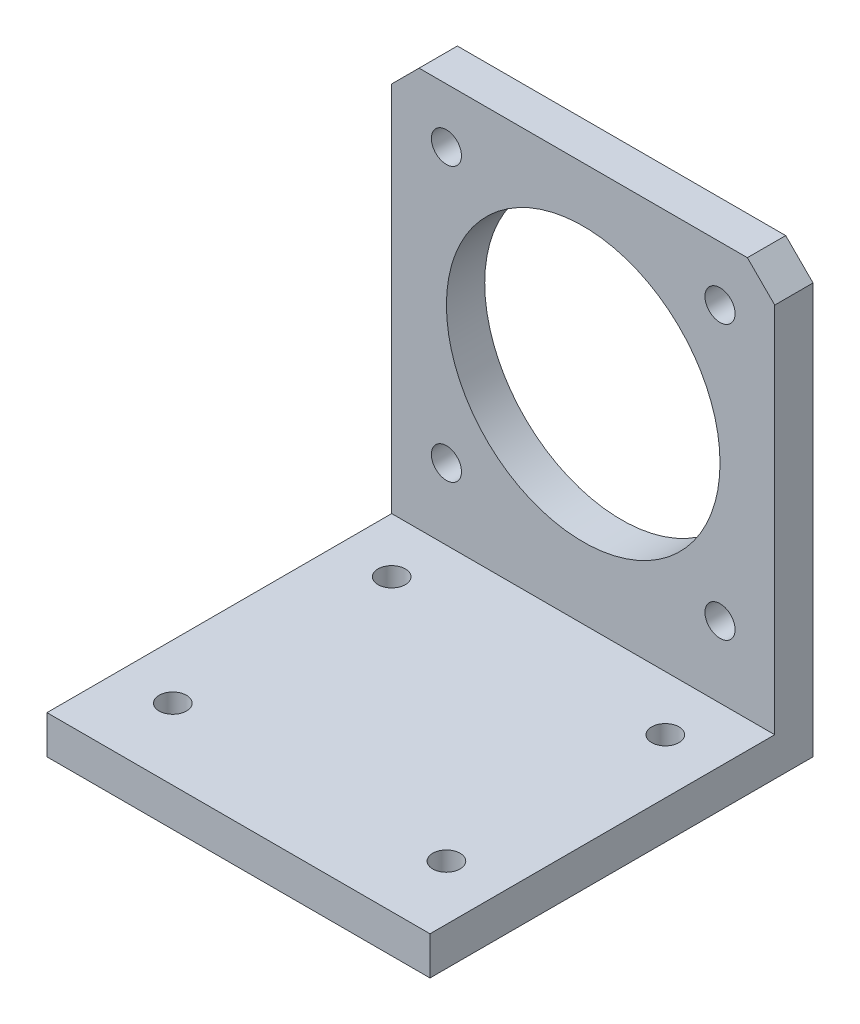
ISO-10303-21;
HEADER;
FILE_DESCRIPTION(('STEP AP214'),'2;1');
FILE_NAME('part.step','',(''),(''),'','','');
FILE_SCHEMA(('AUTOMOTIVE_DESIGN { 1 0 10303 214 1 1 1 1 }'));
ENDSEC;
DATA;
#1=APPLICATION_CONTEXT('core data for automotive mechanical design processes');
#2=APPLICATION_PROTOCOL_DEFINITION('international standard','automotive_design',2000,#1);
#3=PRODUCT_CONTEXT('',#1,'mechanical');
#4=PRODUCT('Part','Part','',(#3));
#5=PRODUCT_RELATED_PRODUCT_CATEGORY('part','',(#4));
#6=PRODUCT_DEFINITION_FORMATION('','',#4);
#7=PRODUCT_DEFINITION_CONTEXT('part definition',#1,'design');
#8=PRODUCT_DEFINITION('design','',#6,#7);
#9=PRODUCT_DEFINITION_SHAPE('','',#8);
#10=(LENGTH_UNIT() NAMED_UNIT(*) SI_UNIT(.MILLI.,.METRE.));
#11=(NAMED_UNIT(*) PLANE_ANGLE_UNIT() SI_UNIT($,.RADIAN.));
#12=(NAMED_UNIT(*) SI_UNIT($,.STERADIAN.) SOLID_ANGLE_UNIT());
#13=UNCERTAINTY_MEASURE_WITH_UNIT(LENGTH_MEASURE(1.E-05),#10,'distance_accuracy_value','');
#14=(GEOMETRIC_REPRESENTATION_CONTEXT(3) GLOBAL_UNCERTAINTY_ASSIGNED_CONTEXT((#13)) GLOBAL_UNIT_ASSIGNED_CONTEXT((#10,
#11,#12)) REPRESENTATION_CONTEXT('',''));
#15=CARTESIAN_POINT('',(0.,0.,0.));
#16=DIRECTION('',(0.,0.,1.));
#17=DIRECTION('',(1.,0.,0.));
#18=AXIS2_PLACEMENT_3D('',#15,#16,#17);
#19=CARTESIAN_POINT('',(0.,0.,7.));
#20=DIRECTION('',(0.,0.,1.));
#21=DIRECTION('',(1.,0.,0.));
#22=AXIS2_PLACEMENT_3D('',#19,#20,#21);
#23=PLANE('',#22);
#24=DIRECTION('',(-1.,0.,0.));
#25=VECTOR('',#24,1.);
#26=CARTESIAN_POINT('',(-35.,40.,7.));
#27=LINE('',#26,#25);
#28=CARTESIAN_POINT('',(30.,40.,7.));
#29=VERTEX_POINT('',#28);
#30=CARTESIAN_POINT('',(-30.,40.,7.));
#31=VERTEX_POINT('',#30);
#32=EDGE_CURVE('E165',#29,#31,#27,.T.);
#33=ORIENTED_EDGE('',*,*,#32,.T.);
#34=DIRECTION('',(0.707106781186549,0.707106781186547,0.));
#35=VECTOR('',#34,1.);
#36=CARTESIAN_POINT('',(-35.,35.0000000000001,7.));
#37=LINE('',#36,#35);
#38=CARTESIAN_POINT('',(-35.,35.,7.));
#39=VERTEX_POINT('',#38);
#40=EDGE_CURVE('E43',#31,#39,#37,.F.);
#41=ORIENTED_EDGE('',*,*,#40,.T.);
#42=DIRECTION('',(0.,-1.,0.));
#43=VECTOR('',#42,1.);
#44=CARTESIAN_POINT('',(-35.,40.,7.));
#45=LINE('',#44,#43);
#46=CARTESIAN_POINT('',(-35.,-33.,7.));
#47=VERTEX_POINT('',#46);
#48=EDGE_CURVE('E168',#39,#47,#45,.T.);
#49=ORIENTED_EDGE('',*,*,#48,.T.);
#50=DIRECTION('',(-1.,0.,0.));
#51=VECTOR('',#50,1.);
#52=CARTESIAN_POINT('',(0.,-33.,7.));
#53=LINE('',#52,#51);
#54=CARTESIAN_POINT('',(35.,-33.,7.));
#55=VERTEX_POINT('',#54);
#56=EDGE_CURVE('E130',#55,#47,#53,.T.);
#57=ORIENTED_EDGE('',*,*,#56,.F.);
#58=DIRECTION('',(0.,1.,0.));
#59=VECTOR('',#58,1.);
#60=CARTESIAN_POINT('',(35.,40.,7.));
#61=LINE('',#60,#59);
#62=CARTESIAN_POINT('',(35.,35.,7.));
#63=VERTEX_POINT('',#62);
#64=EDGE_CURVE('E107',#55,#63,#61,.T.);
#65=ORIENTED_EDGE('',*,*,#64,.T.);
#66=DIRECTION('',(0.707106781186547,-0.707106781186549,0.));
#67=VECTOR('',#66,1.);
#68=CARTESIAN_POINT('',(35.,35.,7.));
#69=LINE('',#68,#67);
#70=EDGE_CURVE('E192',#63,#29,#69,.F.);
#71=ORIENTED_EDGE('',*,*,#70,.T.);
#72=EDGE_LOOP('',(#33,#41,#49,#57,#65,#71));
#73=FACE_BOUND('',#72,.T.);
#74=CARTESIAN_POINT('',(25.0000000000005,-20.,7.));
#75=DIRECTION('',(0.,0.,1.));
#76=DIRECTION('',(1.,0.,0.));
#77=AXIS2_PLACEMENT_3D('',#74,#75,#76);
#78=CIRCLE('',#77,2.75);
#79=CARTESIAN_POINT('',(27.7500000000005,-20.,7.));
#80=VERTEX_POINT('',#79);
#81=EDGE_CURVE('E140',#80,#80,#78,.T.);
#82=ORIENTED_EDGE('',*,*,#81,.F.);
#83=EDGE_LOOP('',(#82));
#84=FACE_BOUND('',#83,.T.);
#85=CARTESIAN_POINT('',(25.,30.,7.));
#86=DIRECTION('',(0.,0.,1.));
#87=DIRECTION('',(1.,0.,0.));
#88=AXIS2_PLACEMENT_3D('',#85,#86,#87);
#89=CIRCLE('',#88,2.75);
#90=CARTESIAN_POINT('',(27.75,30.,7.));
#91=VERTEX_POINT('',#90);
#92=EDGE_CURVE('E152',#91,#91,#89,.T.);
#93=ORIENTED_EDGE('',*,*,#92,.F.);
#94=EDGE_LOOP('',(#93));
#95=FACE_BOUND('',#94,.T.);
#96=CARTESIAN_POINT('',(-25.,30.,7.));
#97=DIRECTION('',(0.,0.,1.));
#98=DIRECTION('',(1.,0.,0.));
#99=AXIS2_PLACEMENT_3D('',#96,#97,#98);
#100=CIRCLE('',#99,2.75);
#101=CARTESIAN_POINT('',(-22.25,30.,7.));
#102=VERTEX_POINT('',#101);
#103=EDGE_CURVE('E158',#102,#102,#100,.T.);
#104=ORIENTED_EDGE('',*,*,#103,.F.);
#105=EDGE_LOOP('',(#104));
#106=FACE_BOUND('',#105,.T.);
#107=CARTESIAN_POINT('',(-24.9999999999995,-20.,7.));
#108=DIRECTION('',(0.,0.,1.));
#109=DIRECTION('',(1.,0.,0.));
#110=AXIS2_PLACEMENT_3D('',#107,#108,#109);
#111=CIRCLE('',#110,2.75);
#112=CARTESIAN_POINT('',(-22.2499999999995,-20.,7.));
#113=VERTEX_POINT('',#112);
#114=EDGE_CURVE('E146',#113,#113,#111,.T.);
#115=ORIENTED_EDGE('',*,*,#114,.F.);
#116=EDGE_LOOP('',(#115));
#117=FACE_BOUND('',#116,.T.);
#118=CARTESIAN_POINT('',(0.,5.,7.));
#119=DIRECTION('',(0.,0.,1.));
#120=DIRECTION('',(1.,0.,0.));
#121=AXIS2_PLACEMENT_3D('',#118,#119,#120);
#122=CIRCLE('',#121,25.);
#123=CARTESIAN_POINT('',(25.,5.,7.));
#124=VERTEX_POINT('',#123);
#125=EDGE_CURVE('E134',#124,#124,#122,.T.);
#126=ORIENTED_EDGE('',*,*,#125,.F.);
#127=EDGE_LOOP('',(#126));
#128=FACE_BOUND('',#127,.T.);
#129=ADVANCED_FACE('F35',(#73,#84,#95,#106,#117,#128),#23,.T.);
#130=CARTESIAN_POINT('',(0.,0.,0.));
#131=DIRECTION('',(0.,0.,1.));
#132=DIRECTION('',(1.,0.,0.));
#133=AXIS2_PLACEMENT_3D('',#130,#131,#132);
#134=PLANE('',#133);
#135=CARTESIAN_POINT('',(25.0000000000005,-20.,0.));
#136=DIRECTION('',(0.,0.,1.));
#137=DIRECTION('',(1.,0.,0.));
#138=AXIS2_PLACEMENT_3D('',#135,#136,#137);
#139=CIRCLE('',#138,2.75);
#140=CARTESIAN_POINT('',(27.7500000000005,-20.,0.));
#141=VERTEX_POINT('',#140);
#142=EDGE_CURVE('E137',#141,#141,#139,.T.);
#143=ORIENTED_EDGE('',*,*,#142,.T.);
#144=EDGE_LOOP('',(#143));
#145=FACE_BOUND('',#144,.T.);
#146=CARTESIAN_POINT('',(25.,30.,0.));
#147=DIRECTION('',(0.,0.,1.));
#148=DIRECTION('',(1.,0.,0.));
#149=AXIS2_PLACEMENT_3D('',#146,#147,#148);
#150=CIRCLE('',#149,2.75);
#151=CARTESIAN_POINT('',(27.75,30.,0.));
#152=VERTEX_POINT('',#151);
#153=EDGE_CURVE('E149',#152,#152,#150,.T.);
#154=ORIENTED_EDGE('',*,*,#153,.T.);
#155=EDGE_LOOP('',(#154));
#156=FACE_BOUND('',#155,.T.);
#157=DIRECTION('',(0.,-1.,0.));
#158=VECTOR('',#157,1.);
#159=CARTESIAN_POINT('',(-35.,40.,0.));
#160=LINE('',#159,#158);
#161=CARTESIAN_POINT('',(-35.,35.,0.));
#162=VERTEX_POINT('',#161);
#163=CARTESIAN_POINT('',(-35.,-40.,0.));
#164=VERTEX_POINT('',#163);
#165=EDGE_CURVE('E174',#162,#164,#160,.T.);
#166=ORIENTED_EDGE('',*,*,#165,.F.);
#167=DIRECTION('',(-0.707106781186549,-0.707106781186547,0.));
#168=VECTOR('',#167,1.);
#169=CARTESIAN_POINT('',(-35.,35.,0.));
#170=LINE('',#169,#168);
#171=CARTESIAN_POINT('',(-30.,40.,0.));
#172=VERTEX_POINT('',#171);
#173=EDGE_CURVE('E186',#162,#172,#170,.F.);
#174=ORIENTED_EDGE('',*,*,#173,.T.);
#175=DIRECTION('',(-1.,0.,0.));
#176=VECTOR('',#175,1.);
#177=CARTESIAN_POINT('',(-35.,40.,0.));
#178=LINE('',#177,#176);
#179=CARTESIAN_POINT('',(30.,40.,0.));
#180=VERTEX_POINT('',#179);
#181=EDGE_CURVE('E172',#180,#172,#178,.T.);
#182=ORIENTED_EDGE('',*,*,#181,.F.);
#183=DIRECTION('',(-0.707106781186547,0.707106781186549,0.));
#184=VECTOR('',#183,1.);
#185=CARTESIAN_POINT('',(30.,40.,0.));
#186=LINE('',#185,#184);
#187=CARTESIAN_POINT('',(35.,35.,0.));
#188=VERTEX_POINT('',#187);
#189=EDGE_CURVE('E184',#180,#188,#186,.F.);
#190=ORIENTED_EDGE('',*,*,#189,.T.);
#191=DIRECTION('',(0.,1.,0.));
#192=VECTOR('',#191,1.);
#193=CARTESIAN_POINT('',(35.,40.,0.));
#194=LINE('',#193,#192);
#195=CARTESIAN_POINT('',(35.,-40.,0.));
#196=VERTEX_POINT('',#195);
#197=EDGE_CURVE('E161',#196,#188,#194,.T.);
#198=ORIENTED_EDGE('',*,*,#197,.F.);
#199=DIRECTION('',(1.,0.,0.));
#200=VECTOR('',#199,1.);
#201=CARTESIAN_POINT('',(-35.,-40.,0.));
#202=LINE('',#201,#200);
#203=EDGE_CURVE('E166',#164,#196,#202,.T.);
#204=ORIENTED_EDGE('',*,*,#203,.F.);
#205=EDGE_LOOP('',(#166,#174,#182,#190,#198,#204));
#206=FACE_BOUND('',#205,.T.);
#207=CARTESIAN_POINT('',(-25.,30.,0.));
#208=DIRECTION('',(0.,0.,1.));
#209=DIRECTION('',(1.,0.,0.));
#210=AXIS2_PLACEMENT_3D('',#207,#208,#209);
#211=CIRCLE('',#210,2.75);
#212=CARTESIAN_POINT('',(-22.25,30.,0.));
#213=VERTEX_POINT('',#212);
#214=EDGE_CURVE('E155',#213,#213,#211,.T.);
#215=ORIENTED_EDGE('',*,*,#214,.T.);
#216=EDGE_LOOP('',(#215));
#217=FACE_BOUND('',#216,.T.);
#218=CARTESIAN_POINT('',(-24.9999999999995,-20.,0.));
#219=DIRECTION('',(0.,0.,1.));
#220=DIRECTION('',(1.,0.,0.));
#221=AXIS2_PLACEMENT_3D('',#218,#219,#220);
#222=CIRCLE('',#221,2.75);
#223=CARTESIAN_POINT('',(-22.2499999999995,-20.,0.));
#224=VERTEX_POINT('',#223);
#225=EDGE_CURVE('E143',#224,#224,#222,.T.);
#226=ORIENTED_EDGE('',*,*,#225,.T.);
#227=EDGE_LOOP('',(#226));
#228=FACE_BOUND('',#227,.T.);
#229=CARTESIAN_POINT('',(0.,5.,0.));
#230=DIRECTION('',(0.,0.,1.));
#231=DIRECTION('',(1.,0.,0.));
#232=AXIS2_PLACEMENT_3D('',#229,#230,#231);
#233=CIRCLE('',#232,25.);
#234=CARTESIAN_POINT('',(25.,5.,0.));
#235=VERTEX_POINT('',#234);
#236=EDGE_CURVE('E133',#235,#235,#233,.T.);
#237=ORIENTED_EDGE('',*,*,#236,.T.);
#238=EDGE_LOOP('',(#237));
#239=FACE_BOUND('',#238,.T.);
#240=ADVANCED_FACE('F205',(#145,#156,#206,#217,#228,#239),#134,.F.);
#241=CARTESIAN_POINT('',(35.,40.,7.));
#242=DIRECTION('',(-1.,0.,0.));
#243=DIRECTION('',(0.,0.,1.));
#244=AXIS2_PLACEMENT_3D('',#241,#242,#243);
#245=PLANE('',#244);
#246=ORIENTED_EDGE('',*,*,#197,.T.);
#247=DIRECTION('',(0.,0.,1.));
#248=VECTOR('',#247,1.);
#249=CARTESIAN_POINT('',(35.,35.,7.));
#250=LINE('',#249,#248);
#251=EDGE_CURVE('E11',#188,#63,#250,.T.);
#252=ORIENTED_EDGE('',*,*,#251,.T.);
#253=ORIENTED_EDGE('',*,*,#64,.F.);
#254=DIRECTION('',(0.,0.,1.));
#255=VECTOR('',#254,1.);
#256=CARTESIAN_POINT('',(35.,-33.,0.));
#257=LINE('',#256,#255);
#258=CARTESIAN_POINT('',(35.,-33.,70.));
#259=VERTEX_POINT('',#258);
#260=EDGE_CURVE('E101',#55,#259,#257,.T.);
#261=ORIENTED_EDGE('',*,*,#260,.T.);
#262=DIRECTION('',(0.,-1.,0.));
#263=VECTOR('',#262,1.);
#264=CARTESIAN_POINT('',(35.,-33.,70.));
#265=LINE('',#264,#263);
#266=CARTESIAN_POINT('',(35.,-40.,70.));
#267=VERTEX_POINT('',#266);
#268=EDGE_CURVE('E105',#259,#267,#265,.T.);
#269=ORIENTED_EDGE('',*,*,#268,.T.);
#270=DIRECTION('',(0.,0.,-1.));
#271=VECTOR('',#270,1.);
#272=CARTESIAN_POINT('',(35.,-40.,7.));
#273=LINE('',#272,#271);
#274=EDGE_CURVE('E170',#267,#196,#273,.T.);
#275=ORIENTED_EDGE('',*,*,#274,.T.);
#276=EDGE_LOOP('',(#246,#252,#253,#261,#269,#275));
#277=FACE_BOUND('',#276,.T.);
#278=ADVANCED_FACE('F103',(#277),#245,.F.);
#279=CARTESIAN_POINT('',(-35.,40.,7.));
#280=DIRECTION('',(0.,-1.,0.));
#281=DIRECTION('',(0.,0.,-1.));
#282=AXIS2_PLACEMENT_3D('',#279,#280,#281);
#283=PLANE('',#282);
#284=ORIENTED_EDGE('',*,*,#181,.T.);
#285=DIRECTION('',(0.,0.,1.));
#286=VECTOR('',#285,1.);
#287=CARTESIAN_POINT('',(-30.,40.,7.));
#288=LINE('',#287,#286);
#289=EDGE_CURVE('E56',#172,#31,#288,.T.);
#290=ORIENTED_EDGE('',*,*,#289,.T.);
#291=ORIENTED_EDGE('',*,*,#32,.F.);
#292=DIRECTION('',(0.,0.,-1.));
#293=VECTOR('',#292,1.);
#294=CARTESIAN_POINT('',(30.,40.,7.));
#295=LINE('',#294,#293);
#296=EDGE_CURVE('E188',#29,#180,#295,.T.);
#297=ORIENTED_EDGE('',*,*,#296,.T.);
#298=EDGE_LOOP('',(#284,#290,#291,#297));
#299=FACE_BOUND('',#298,.T.);
#300=ADVANCED_FACE('F208',(#299),#283,.F.);
#301=CARTESIAN_POINT('',(-35.,40.,7.));
#302=DIRECTION('',(1.,0.,0.));
#303=DIRECTION('',(0.,1.,0.));
#304=AXIS2_PLACEMENT_3D('',#301,#302,#303);
#305=PLANE('',#304);
#306=ORIENTED_EDGE('',*,*,#48,.F.);
#307=DIRECTION('',(0.,0.,-1.));
#308=VECTOR('',#307,1.);
#309=CARTESIAN_POINT('',(-35.,35.,7.));
#310=LINE('',#309,#308);
#311=EDGE_CURVE('E181',#39,#162,#310,.T.);
#312=ORIENTED_EDGE('',*,*,#311,.T.);
#313=ORIENTED_EDGE('',*,*,#165,.T.);
#314=DIRECTION('',(0.,0.,-1.));
#315=VECTOR('',#314,1.);
#316=CARTESIAN_POINT('',(-35.,-40.,7.));
#317=LINE('',#316,#315);
#318=CARTESIAN_POINT('',(-35.,-40.,70.));
#319=VERTEX_POINT('',#318);
#320=EDGE_CURVE('E178',#319,#164,#317,.T.);
#321=ORIENTED_EDGE('',*,*,#320,.F.);
#322=DIRECTION('',(0.,-1.,0.));
#323=VECTOR('',#322,1.);
#324=CARTESIAN_POINT('',(-35.,-33.,70.));
#325=LINE('',#324,#323);
#326=CARTESIAN_POINT('',(-35.,-33.,70.));
#327=VERTEX_POINT('',#326);
#328=EDGE_CURVE('E120',#327,#319,#325,.T.);
#329=ORIENTED_EDGE('',*,*,#328,.F.);
#330=DIRECTION('',(0.,0.,-1.));
#331=VECTOR('',#330,1.);
#332=CARTESIAN_POINT('',(-35.,-33.,0.));
#333=LINE('',#332,#331);
#334=EDGE_CURVE('E112',#327,#47,#333,.T.);
#335=ORIENTED_EDGE('',*,*,#334,.T.);
#336=EDGE_LOOP('',(#306,#312,#313,#321,#329,#335));
#337=FACE_BOUND('',#336,.T.);
#338=ADVANCED_FACE('F200',(#337),#305,.F.);
#339=CARTESIAN_POINT('',(-35.,-40.,7.));
#340=DIRECTION('',(0.,1.,0.));
#341=DIRECTION('',(0.,0.,1.));
#342=AXIS2_PLACEMENT_3D('',#339,#340,#341);
#343=PLANE('',#342);
#344=CARTESIAN_POINT('',(25.0000000000004,-40.,57.));
#345=DIRECTION('',(0.,1.,0.));
#346=DIRECTION('',(0.,0.,1.));
#347=AXIS2_PLACEMENT_3D('',#344,#345,#346);
#348=CIRCLE('',#347,2.5);
#349=CARTESIAN_POINT('',(25.0000000000004,-40.,59.5));
#350=VERTEX_POINT('',#349);
#351=EDGE_CURVE('E278',#350,#350,#348,.T.);
#352=ORIENTED_EDGE('',*,*,#351,.T.);
#353=EDGE_LOOP('',(#352));
#354=FACE_BOUND('',#353,.T.);
#355=CARTESIAN_POINT('',(-24.9999999999996,-40.,57.));
#356=DIRECTION('',(0.,1.,0.));
#357=DIRECTION('',(0.,0.,1.));
#358=AXIS2_PLACEMENT_3D('',#355,#356,#357);
#359=CIRCLE('',#358,2.5);
#360=CARTESIAN_POINT('',(-24.9999999999996,-40.,59.5));
#361=VERTEX_POINT('',#360);
#362=EDGE_CURVE('E286',#361,#361,#359,.T.);
#363=ORIENTED_EDGE('',*,*,#362,.T.);
#364=EDGE_LOOP('',(#363));
#365=FACE_BOUND('',#364,.T.);
#366=CARTESIAN_POINT('',(25.,-40.,17.));
#367=DIRECTION('',(0.,1.,0.));
#368=DIRECTION('',(0.,0.,1.));
#369=AXIS2_PLACEMENT_3D('',#366,#367,#368);
#370=CIRCLE('',#369,2.5);
#371=CARTESIAN_POINT('',(25.,-40.,19.5));
#372=VERTEX_POINT('',#371);
#373=EDGE_CURVE('E292',#372,#372,#370,.T.);
#374=ORIENTED_EDGE('',*,*,#373,.T.);
#375=EDGE_LOOP('',(#374));
#376=FACE_BOUND('',#375,.T.);
#377=CARTESIAN_POINT('',(-25.,-40.,17.));
#378=DIRECTION('',(0.,1.,0.));
#379=DIRECTION('',(0.,0.,1.));
#380=AXIS2_PLACEMENT_3D('',#377,#378,#379);
#381=CIRCLE('',#380,2.5);
#382=CARTESIAN_POINT('',(-25.,-40.,19.5));
#383=VERTEX_POINT('',#382);
#384=EDGE_CURVE('E129',#383,#383,#381,.T.);
#385=ORIENTED_EDGE('',*,*,#384,.T.);
#386=EDGE_LOOP('',(#385));
#387=FACE_BOUND('',#386,.T.);
#388=ORIENTED_EDGE('',*,*,#203,.T.);
#389=ORIENTED_EDGE('',*,*,#274,.F.);
#390=DIRECTION('',(-1.,0.,0.));
#391=VECTOR('',#390,1.);
#392=CARTESIAN_POINT('',(-35.,-40.,70.));
#393=LINE('',#392,#391);
#394=EDGE_CURVE('E119',#267,#319,#393,.T.);
#395=ORIENTED_EDGE('',*,*,#394,.T.);
#396=ORIENTED_EDGE('',*,*,#320,.T.);
#397=EDGE_LOOP('',(#388,#389,#395,#396));
#398=FACE_BOUND('',#397,.T.);
#399=ADVANCED_FACE('F214',(#354,#365,#376,#387,#398),#343,.F.);
#400=CARTESIAN_POINT('',(-25.,30.,7.));
#401=DIRECTION('',(0.,0.,-1.));
#402=DIRECTION('',(-1.,0.,0.));
#403=AXIS2_PLACEMENT_3D('',#400,#401,#402);
#404=CYLINDRICAL_SURFACE('',#403,2.75);
#405=ORIENTED_EDGE('',*,*,#103,.T.);
#406=EDGE_LOOP('',(#405));
#407=FACE_BOUND('',#406,.T.);
#408=ORIENTED_EDGE('',*,*,#214,.F.);
#409=EDGE_LOOP('',(#408));
#410=FACE_BOUND('',#409,.T.);
#411=ADVANCED_FACE('F216',(#407,#410),#404,.F.);
#412=CARTESIAN_POINT('',(25.,30.,7.));
#413=DIRECTION('',(0.,0.,-1.));
#414=DIRECTION('',(-1.,0.,0.));
#415=AXIS2_PLACEMENT_3D('',#412,#413,#414);
#416=CYLINDRICAL_SURFACE('',#415,2.75);
#417=ORIENTED_EDGE('',*,*,#92,.T.);
#418=EDGE_LOOP('',(#417));
#419=FACE_BOUND('',#418,.T.);
#420=ORIENTED_EDGE('',*,*,#153,.F.);
#421=EDGE_LOOP('',(#420));
#422=FACE_BOUND('',#421,.T.);
#423=ADVANCED_FACE('F223',(#419,#422),#416,.F.);
#424=CARTESIAN_POINT('',(-24.9999999999995,-20.,7.));
#425=DIRECTION('',(0.,0.,-1.));
#426=DIRECTION('',(-1.,0.,0.));
#427=AXIS2_PLACEMENT_3D('',#424,#425,#426);
#428=CYLINDRICAL_SURFACE('',#427,2.75);
#429=ORIENTED_EDGE('',*,*,#114,.T.);
#430=EDGE_LOOP('',(#429));
#431=FACE_BOUND('',#430,.T.);
#432=ORIENTED_EDGE('',*,*,#225,.F.);
#433=EDGE_LOOP('',(#432));
#434=FACE_BOUND('',#433,.T.);
#435=ADVANCED_FACE('F241',(#431,#434),#428,.F.);
#436=CARTESIAN_POINT('',(25.0000000000005,-20.,7.));
#437=DIRECTION('',(0.,0.,-1.));
#438=DIRECTION('',(-1.,0.,0.));
#439=AXIS2_PLACEMENT_3D('',#436,#437,#438);
#440=CYLINDRICAL_SURFACE('',#439,2.75);
#441=ORIENTED_EDGE('',*,*,#81,.T.);
#442=EDGE_LOOP('',(#441));
#443=FACE_BOUND('',#442,.T.);
#444=ORIENTED_EDGE('',*,*,#142,.F.);
#445=EDGE_LOOP('',(#444));
#446=FACE_BOUND('',#445,.T.);
#447=ADVANCED_FACE('F245',(#443,#446),#440,.F.);
#448=CARTESIAN_POINT('',(0.,5.,7.));
#449=DIRECTION('',(0.,0.,-1.));
#450=DIRECTION('',(-1.,0.,0.));
#451=AXIS2_PLACEMENT_3D('',#448,#449,#450);
#452=CYLINDRICAL_SURFACE('',#451,25.);
#453=ORIENTED_EDGE('',*,*,#125,.T.);
#454=EDGE_LOOP('',(#453));
#455=FACE_BOUND('',#454,.T.);
#456=ORIENTED_EDGE('',*,*,#236,.F.);
#457=EDGE_LOOP('',(#456));
#458=FACE_BOUND('',#457,.T.);
#459=ADVANCED_FACE('F249',(#455,#458),#452,.F.);
#460=CARTESIAN_POINT('',(-35.,-33.,70.));
#461=DIRECTION('',(0.,0.,1.));
#462=DIRECTION('',(1.,0.,0.));
#463=AXIS2_PLACEMENT_3D('',#460,#461,#462);
#464=PLANE('',#463);
#465=ORIENTED_EDGE('',*,*,#394,.F.);
#466=ORIENTED_EDGE('',*,*,#268,.F.);
#467=DIRECTION('',(-1.,0.,0.));
#468=VECTOR('',#467,1.);
#469=CARTESIAN_POINT('',(-35.,-33.,70.));
#470=LINE('',#469,#468);
#471=EDGE_CURVE('E111',#259,#327,#470,.T.);
#472=ORIENTED_EDGE('',*,*,#471,.T.);
#473=ORIENTED_EDGE('',*,*,#328,.T.);
#474=EDGE_LOOP('',(#465,#466,#472,#473));
#475=FACE_BOUND('',#474,.T.);
#476=ADVANCED_FACE('F116',(#475),#464,.T.);
#477=CARTESIAN_POINT('',(0.,-33.,0.));
#478=DIRECTION('',(0.,1.,0.));
#479=DIRECTION('',(0.,0.,1.));
#480=AXIS2_PLACEMENT_3D('',#477,#478,#479);
#481=PLANE('',#480);
#482=CARTESIAN_POINT('',(25.0000000000004,-33.,57.));
#483=DIRECTION('',(0.,1.,0.));
#484=DIRECTION('',(0.,0.,1.));
#485=AXIS2_PLACEMENT_3D('',#482,#483,#484);
#486=CIRCLE('',#485,2.5);
#487=CARTESIAN_POINT('',(25.0000000000004,-33.,59.5));
#488=VERTEX_POINT('',#487);
#489=EDGE_CURVE('E281',#488,#488,#486,.T.);
#490=ORIENTED_EDGE('',*,*,#489,.F.);
#491=EDGE_LOOP('',(#490));
#492=FACE_BOUND('',#491,.T.);
#493=CARTESIAN_POINT('',(-24.9999999999996,-33.,57.));
#494=DIRECTION('',(0.,1.,0.));
#495=DIRECTION('',(0.,0.,1.));
#496=AXIS2_PLACEMENT_3D('',#493,#494,#495);
#497=CIRCLE('',#496,2.5);
#498=CARTESIAN_POINT('',(-24.9999999999996,-33.,59.5));
#499=VERTEX_POINT('',#498);
#500=EDGE_CURVE('E283',#499,#499,#497,.T.);
#501=ORIENTED_EDGE('',*,*,#500,.F.);
#502=EDGE_LOOP('',(#501));
#503=FACE_BOUND('',#502,.T.);
#504=CARTESIAN_POINT('',(25.,-33.,17.));
#505=DIRECTION('',(0.,1.,0.));
#506=DIRECTION('',(0.,0.,1.));
#507=AXIS2_PLACEMENT_3D('',#504,#505,#506);
#508=CIRCLE('',#507,2.5);
#509=CARTESIAN_POINT('',(25.,-33.,19.5));
#510=VERTEX_POINT('',#509);
#511=EDGE_CURVE('E289',#510,#510,#508,.T.);
#512=ORIENTED_EDGE('',*,*,#511,.F.);
#513=EDGE_LOOP('',(#512));
#514=FACE_BOUND('',#513,.T.);
#515=CARTESIAN_POINT('',(-25.,-33.,17.));
#516=DIRECTION('',(0.,1.,0.));
#517=DIRECTION('',(0.,0.,1.));
#518=AXIS2_PLACEMENT_3D('',#515,#516,#517);
#519=CIRCLE('',#518,2.5);
#520=CARTESIAN_POINT('',(-25.,-33.,19.5));
#521=VERTEX_POINT('',#520);
#522=EDGE_CURVE('E295',#521,#521,#519,.T.);
#523=ORIENTED_EDGE('',*,*,#522,.F.);
#524=EDGE_LOOP('',(#523));
#525=FACE_BOUND('',#524,.T.);
#526=ORIENTED_EDGE('',*,*,#260,.F.);
#527=ORIENTED_EDGE('',*,*,#56,.T.);
#528=ORIENTED_EDGE('',*,*,#334,.F.);
#529=ORIENTED_EDGE('',*,*,#471,.F.);
#530=EDGE_LOOP('',(#526,#527,#528,#529));
#531=FACE_BOUND('',#530,.T.);
#532=ADVANCED_FACE('F123',(#492,#503,#514,#525,#531),#481,.T.);
#533=CARTESIAN_POINT('',(-25.,-40.,17.));
#534=DIRECTION('',(0.,1.,0.));
#535=DIRECTION('',(0.,0.,1.));
#536=AXIS2_PLACEMENT_3D('',#533,#534,#535);
#537=CYLINDRICAL_SURFACE('',#536,2.5);
#538=ORIENTED_EDGE('',*,*,#384,.F.);
#539=EDGE_LOOP('',(#538));
#540=FACE_BOUND('',#539,.T.);
#541=ORIENTED_EDGE('',*,*,#522,.T.);
#542=EDGE_LOOP('',(#541));
#543=FACE_BOUND('',#542,.T.);
#544=ADVANCED_FACE('F258',(#540,#543),#537,.F.);
#545=CARTESIAN_POINT('',(25.,-40.,17.));
#546=DIRECTION('',(0.,1.,0.));
#547=DIRECTION('',(0.,0.,1.));
#548=AXIS2_PLACEMENT_3D('',#545,#546,#547);
#549=CYLINDRICAL_SURFACE('',#548,2.5);
#550=ORIENTED_EDGE('',*,*,#373,.F.);
#551=EDGE_LOOP('',(#550));
#552=FACE_BOUND('',#551,.T.);
#553=ORIENTED_EDGE('',*,*,#511,.T.);
#554=EDGE_LOOP('',(#553));
#555=FACE_BOUND('',#554,.T.);
#556=ADVANCED_FACE('F262',(#552,#555),#549,.F.);
#557=CARTESIAN_POINT('',(-24.9999999999996,-40.,57.));
#558=DIRECTION('',(0.,1.,0.));
#559=DIRECTION('',(0.,0.,1.));
#560=AXIS2_PLACEMENT_3D('',#557,#558,#559);
#561=CYLINDRICAL_SURFACE('',#560,2.5);
#562=ORIENTED_EDGE('',*,*,#362,.F.);
#563=EDGE_LOOP('',(#562));
#564=FACE_BOUND('',#563,.T.);
#565=ORIENTED_EDGE('',*,*,#500,.T.);
#566=EDGE_LOOP('',(#565));
#567=FACE_BOUND('',#566,.T.);
#568=ADVANCED_FACE('F266',(#564,#567),#561,.F.);
#569=CARTESIAN_POINT('',(25.0000000000004,-40.,57.));
#570=DIRECTION('',(0.,1.,0.));
#571=DIRECTION('',(0.,0.,1.));
#572=AXIS2_PLACEMENT_3D('',#569,#570,#571);
#573=CYLINDRICAL_SURFACE('',#572,2.5);
#574=ORIENTED_EDGE('',*,*,#351,.F.);
#575=EDGE_LOOP('',(#574));
#576=FACE_BOUND('',#575,.T.);
#577=ORIENTED_EDGE('',*,*,#489,.T.);
#578=EDGE_LOOP('',(#577));
#579=FACE_BOUND('',#578,.T.);
#580=ADVANCED_FACE('F270',(#576,#579),#573,.F.);
#581=CARTESIAN_POINT('',(-35.,35.,7.));
#582=DIRECTION('',(0.707106781186546,-0.707106781186548,0.));
#583=DIRECTION('',(0.,0.,-1.));
#584=AXIS2_PLACEMENT_3D('',#581,#582,#583);
#585=PLANE('',#584);
#586=ORIENTED_EDGE('',*,*,#40,.F.);
#587=ORIENTED_EDGE('',*,*,#289,.F.);
#588=ORIENTED_EDGE('',*,*,#173,.F.);
#589=ORIENTED_EDGE('',*,*,#311,.F.);
#590=EDGE_LOOP('',(#586,#587,#588,#589));
#591=FACE_BOUND('',#590,.T.);
#592=ADVANCED_FACE('F202',(#591),#585,.F.);
#593=CARTESIAN_POINT('',(30.,40.,7.));
#594=DIRECTION('',(-0.707106781186548,-0.707106781186546,0.));
#595=DIRECTION('',(0.,0.,-1.));
#596=AXIS2_PLACEMENT_3D('',#593,#594,#595);
#597=PLANE('',#596);
#598=ORIENTED_EDGE('',*,*,#70,.F.);
#599=ORIENTED_EDGE('',*,*,#251,.F.);
#600=ORIENTED_EDGE('',*,*,#189,.F.);
#601=ORIENTED_EDGE('',*,*,#296,.F.);
#602=EDGE_LOOP('',(#598,#599,#600,#601));
#603=FACE_BOUND('',#602,.T.);
#604=ADVANCED_FACE('F37',(#603),#597,.F.);
#605=CLOSED_SHELL('',(#129,#240,#278,#300,#338,#399,#411,#423,#435,#447,#459,#476,#532,#544,
#556,#568,#580,#592,#604));
#606=MANIFOLD_SOLID_BREP('B2',#605);
#607=ADVANCED_BREP_SHAPE_REPRESENTATION('',(#18,#606),#14);
#608=SHAPE_DEFINITION_REPRESENTATION(#9,#607);
ENDSEC;
END-ISO-10303-21;
